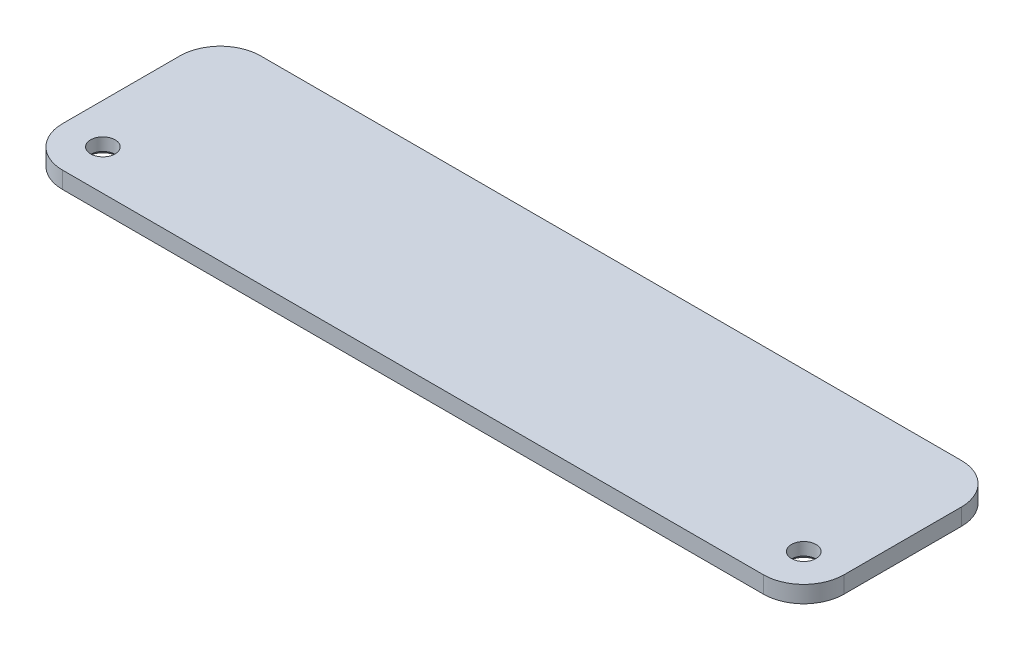
ISO-10303-21;
HEADER;
FILE_DESCRIPTION(('STEP AP214'),'2;1');
FILE_NAME('part.step','',(''),(''),'','','');
FILE_SCHEMA(('AUTOMOTIVE_DESIGN { 1 0 10303 214 1 1 1 1 }'));
ENDSEC;
DATA;
#1=APPLICATION_CONTEXT('core data for automotive mechanical design processes');
#2=APPLICATION_PROTOCOL_DEFINITION('international standard','automotive_design',2000,#1);
#3=PRODUCT_CONTEXT('',#1,'mechanical');
#4=PRODUCT('Part','Part','',(#3));
#5=PRODUCT_RELATED_PRODUCT_CATEGORY('part','',(#4));
#6=PRODUCT_DEFINITION_FORMATION('','',#4);
#7=PRODUCT_DEFINITION_CONTEXT('part definition',#1,'design');
#8=PRODUCT_DEFINITION('design','',#6,#7);
#9=PRODUCT_DEFINITION_SHAPE('','',#8);
#10=(LENGTH_UNIT() NAMED_UNIT(*) SI_UNIT(.MILLI.,.METRE.));
#11=(NAMED_UNIT(*) PLANE_ANGLE_UNIT() SI_UNIT($,.RADIAN.));
#12=(NAMED_UNIT(*) SI_UNIT($,.STERADIAN.) SOLID_ANGLE_UNIT());
#13=UNCERTAINTY_MEASURE_WITH_UNIT(LENGTH_MEASURE(1.E-05),#10,'distance_accuracy_value','');
#14=(GEOMETRIC_REPRESENTATION_CONTEXT(3) GLOBAL_UNCERTAINTY_ASSIGNED_CONTEXT((#13)) GLOBAL_UNIT_ASSIGNED_CONTEXT((#10,
#11,#12)) REPRESENTATION_CONTEXT('',''));
#15=CARTESIAN_POINT('',(0.,0.,0.));
#16=DIRECTION('',(0.,0.,1.));
#17=DIRECTION('',(1.,0.,0.));
#18=AXIS2_PLACEMENT_3D('',#15,#16,#17);
#19=CARTESIAN_POINT('',(50.,2.4,-22.5));
#20=DIRECTION('',(0.,-1.,0.));
#21=DIRECTION('',(0.,0.,-1.));
#22=AXIS2_PLACEMENT_3D('',#19,#20,#21);
#23=PLANE('',#22);
#24=CARTESIAN_POINT('',(50.,2.4,-22.5));
#25=DIRECTION('',(0.,1.,0.));
#26=DIRECTION('',(0.,0.,-1.));
#27=AXIS2_PLACEMENT_3D('',#24,#25,#26);
#28=CIRCLE('',#27,5.75);
#29=CARTESIAN_POINT('',(55.75,2.4,-22.5));
#30=VERTEX_POINT('',#29);
#31=CARTESIAN_POINT('',(50.,2.4,-28.25));
#32=VERTEX_POINT('',#31);
#33=EDGE_CURVE('E174',#30,#32,#28,.T.);
#34=ORIENTED_EDGE('',*,*,#33,.T.);
#35=DIRECTION('',(-1.,0.,0.));
#36=VECTOR('',#35,1.);
#37=CARTESIAN_POINT('',(-50.,2.4,-28.25));
#38=LINE('',#37,#36);
#39=CARTESIAN_POINT('',(-50.,2.4,-28.25));
#40=VERTEX_POINT('',#39);
#41=EDGE_CURVE('E110',#32,#40,#38,.T.);
#42=ORIENTED_EDGE('',*,*,#41,.T.);
#43=CARTESIAN_POINT('',(-50.,2.4,-22.5));
#44=DIRECTION('',(0.,1.,0.));
#45=DIRECTION('',(0.,0.,1.));
#46=AXIS2_PLACEMENT_3D('',#43,#44,#45);
#47=CIRCLE('',#46,5.75);
#48=CARTESIAN_POINT('',(-55.75,2.4,-22.5));
#49=VERTEX_POINT('',#48);
#50=EDGE_CURVE('E263',#40,#49,#47,.T.);
#51=ORIENTED_EDGE('',*,*,#50,.T.);
#52=DIRECTION('',(0.,0.,1.));
#53=VECTOR('',#52,1.);
#54=CARTESIAN_POINT('',(-55.75,2.4,-22.5));
#55=LINE('',#54,#53);
#56=CARTESIAN_POINT('',(-55.75,2.4,-5.75000000000001));
#57=VERTEX_POINT('',#56);
#58=EDGE_CURVE('E266',#49,#57,#55,.T.);
#59=ORIENTED_EDGE('',*,*,#58,.T.);
#60=CARTESIAN_POINT('',(-50.,2.4,-5.75000000000001));
#61=DIRECTION('',(0.,1.,0.));
#62=DIRECTION('',(0.,0.,1.));
#63=AXIS2_PLACEMENT_3D('',#60,#61,#62);
#64=CIRCLE('',#63,5.75);
#65=CARTESIAN_POINT('',(-50.,2.4,0.));
#66=VERTEX_POINT('',#65);
#67=EDGE_CURVE('E129',#57,#66,#64,.T.);
#68=ORIENTED_EDGE('',*,*,#67,.T.);
#69=DIRECTION('',(1.,0.,0.));
#70=VECTOR('',#69,1.);
#71=CARTESIAN_POINT('',(-50.,2.4,0.));
#72=LINE('',#71,#70);
#73=CARTESIAN_POINT('',(50.,2.4,0.));
#74=VERTEX_POINT('',#73);
#75=EDGE_CURVE('E123',#66,#74,#72,.T.);
#76=ORIENTED_EDGE('',*,*,#75,.T.);
#77=CARTESIAN_POINT('',(50.,2.4,-5.74999999999999));
#78=DIRECTION('',(0.,1.,0.));
#79=DIRECTION('',(0.,0.,1.));
#80=AXIS2_PLACEMENT_3D('',#77,#78,#79);
#81=CIRCLE('',#80,5.74999999999999);
#82=CARTESIAN_POINT('',(55.75,2.4,-5.74999999999999));
#83=VERTEX_POINT('',#82);
#84=EDGE_CURVE('E127',#74,#83,#81,.T.);
#85=ORIENTED_EDGE('',*,*,#84,.T.);
#86=DIRECTION('',(0.,0.,-1.));
#87=VECTOR('',#86,1.);
#88=CARTESIAN_POINT('',(55.75,2.4,-22.5));
#89=LINE('',#88,#87);
#90=EDGE_CURVE('E66',#83,#30,#89,.T.);
#91=ORIENTED_EDGE('',*,*,#90,.T.);
#92=EDGE_LOOP('',(#34,#42,#51,#59,#68,#76,#85,#91));
#93=FACE_BOUND('',#92,.T.);
#94=CARTESIAN_POINT('',(50.,2.4,-5.74999999999999));
#95=DIRECTION('',(0.,1.,0.));
#96=DIRECTION('',(0.,0.,1.));
#97=AXIS2_PLACEMENT_3D('',#94,#95,#96);
#98=CIRCLE('',#97,1.75);
#99=CARTESIAN_POINT('',(50.,2.4,-3.99999999999999));
#100=VERTEX_POINT('',#99);
#101=EDGE_CURVE('E156',#100,#100,#98,.T.);
#102=ORIENTED_EDGE('',*,*,#101,.F.);
#103=EDGE_LOOP('',(#102));
#104=FACE_BOUND('',#103,.T.);
#105=CARTESIAN_POINT('',(-50.,2.4,-5.75000000000001));
#106=DIRECTION('',(0.,1.,0.));
#107=DIRECTION('',(0.,0.,1.));
#108=AXIS2_PLACEMENT_3D('',#105,#106,#107);
#109=CIRCLE('',#108,1.75);
#110=CARTESIAN_POINT('',(-50.,2.4,-4.00000000000001));
#111=VERTEX_POINT('',#110);
#112=EDGE_CURVE('E251',#111,#111,#109,.T.);
#113=ORIENTED_EDGE('',*,*,#112,.F.);
#114=EDGE_LOOP('',(#113));
#115=FACE_BOUND('',#114,.T.);
#116=ADVANCED_FACE('F47',(#93,#104,#115),#23,.F.);
#117=CARTESIAN_POINT('',(50.,0.,-22.5));
#118=DIRECTION('',(0.,-1.,0.));
#119=DIRECTION('',(0.,0.,-1.));
#120=AXIS2_PLACEMENT_3D('',#117,#118,#119);
#121=PLANE('',#120);
#122=CARTESIAN_POINT('',(50.,0.,-5.74999999999999));
#123=DIRECTION('',(0.,-1.,0.));
#124=DIRECTION('',(0.,0.,-1.));
#125=AXIS2_PLACEMENT_3D('',#122,#123,#124);
#126=CIRCLE('',#125,2.35000000000001);
#127=CARTESIAN_POINT('',(50.,0.,-8.1));
#128=VERTEX_POINT('',#127);
#129=EDGE_CURVE('E200',#128,#128,#126,.F.);
#130=ORIENTED_EDGE('',*,*,#129,.T.);
#131=EDGE_LOOP('',(#130));
#132=FACE_BOUND('',#131,.T.);
#133=CARTESIAN_POINT('',(-50.,0.,-5.75000000000001));
#134=DIRECTION('',(0.,-1.,0.));
#135=DIRECTION('',(0.,0.,-1.));
#136=AXIS2_PLACEMENT_3D('',#133,#134,#135);
#137=CIRCLE('',#136,2.35000000000002);
#138=CARTESIAN_POINT('',(-50.,0.,-8.10000000000003));
#139=VERTEX_POINT('',#138);
#140=EDGE_CURVE('E196',#139,#139,#137,.F.);
#141=ORIENTED_EDGE('',*,*,#140,.T.);
#142=EDGE_LOOP('',(#141));
#143=FACE_BOUND('',#142,.T.);
#144=CARTESIAN_POINT('',(50.,0.,-22.5));
#145=DIRECTION('',(0.,1.,0.));
#146=DIRECTION('',(0.,0.,-1.));
#147=AXIS2_PLACEMENT_3D('',#144,#145,#146);
#148=CIRCLE('',#147,5.75);
#149=CARTESIAN_POINT('',(55.75,0.,-22.5));
#150=VERTEX_POINT('',#149);
#151=CARTESIAN_POINT('',(50.,0.,-28.25));
#152=VERTEX_POINT('',#151);
#153=EDGE_CURVE('E151',#150,#152,#148,.T.);
#154=ORIENTED_EDGE('',*,*,#153,.F.);
#155=DIRECTION('',(0.,0.,-1.));
#156=VECTOR('',#155,1.);
#157=CARTESIAN_POINT('',(55.75,0.,-22.5));
#158=LINE('',#157,#156);
#159=CARTESIAN_POINT('',(55.75,0.,-5.74999999999999));
#160=VERTEX_POINT('',#159);
#161=EDGE_CURVE('E101',#160,#150,#158,.T.);
#162=ORIENTED_EDGE('',*,*,#161,.F.);
#163=CARTESIAN_POINT('',(50.,0.,-5.74999999999999));
#164=DIRECTION('',(0.,1.,0.));
#165=DIRECTION('',(0.,0.,1.));
#166=AXIS2_PLACEMENT_3D('',#163,#164,#165);
#167=CIRCLE('',#166,5.74999999999999);
#168=CARTESIAN_POINT('',(50.,0.,0.));
#169=VERTEX_POINT('',#168);
#170=EDGE_CURVE('E95',#169,#160,#167,.T.);
#171=ORIENTED_EDGE('',*,*,#170,.F.);
#172=DIRECTION('',(1.,0.,0.));
#173=VECTOR('',#172,1.);
#174=CARTESIAN_POINT('',(-50.,0.,0.));
#175=LINE('',#174,#173);
#176=CARTESIAN_POINT('',(-50.,0.,0.));
#177=VERTEX_POINT('',#176);
#178=EDGE_CURVE('E138',#177,#169,#175,.T.);
#179=ORIENTED_EDGE('',*,*,#178,.F.);
#180=CARTESIAN_POINT('',(-50.,0.,-5.75000000000001));
#181=DIRECTION('',(0.,1.,0.));
#182=DIRECTION('',(0.,0.,1.));
#183=AXIS2_PLACEMENT_3D('',#180,#181,#182);
#184=CIRCLE('',#183,5.75);
#185=CARTESIAN_POINT('',(-55.75,0.,-5.75000000000001));
#186=VERTEX_POINT('',#185);
#187=EDGE_CURVE('E165',#186,#177,#184,.T.);
#188=ORIENTED_EDGE('',*,*,#187,.F.);
#189=DIRECTION('',(0.,0.,1.));
#190=VECTOR('',#189,1.);
#191=CARTESIAN_POINT('',(-55.75,0.,-22.5));
#192=LINE('',#191,#190);
#193=CARTESIAN_POINT('',(-55.75,0.,-22.5));
#194=VERTEX_POINT('',#193);
#195=EDGE_CURVE('E162',#194,#186,#192,.T.);
#196=ORIENTED_EDGE('',*,*,#195,.F.);
#197=CARTESIAN_POINT('',(-50.,0.,-22.5));
#198=DIRECTION('',(0.,1.,0.));
#199=DIRECTION('',(0.,0.,1.));
#200=AXIS2_PLACEMENT_3D('',#197,#198,#199);
#201=CIRCLE('',#200,5.75);
#202=CARTESIAN_POINT('',(-50.,0.,-28.25));
#203=VERTEX_POINT('',#202);
#204=EDGE_CURVE('E159',#203,#194,#201,.T.);
#205=ORIENTED_EDGE('',*,*,#204,.F.);
#206=DIRECTION('',(-1.,0.,0.));
#207=VECTOR('',#206,1.);
#208=CARTESIAN_POINT('',(-50.,0.,-28.25));
#209=LINE('',#208,#207);
#210=EDGE_CURVE('E155',#152,#203,#209,.T.);
#211=ORIENTED_EDGE('',*,*,#210,.F.);
#212=EDGE_LOOP('',(#154,#162,#171,#179,#188,#196,#205,#211));
#213=FACE_BOUND('',#212,.T.);
#214=ADVANCED_FACE('F216',(#132,#143,#213),#121,.T.);
#215=CARTESIAN_POINT('',(50.,2.4,-22.5));
#216=DIRECTION('',(0.,-1.,0.));
#217=DIRECTION('',(0.,0.,-1.));
#218=AXIS2_PLACEMENT_3D('',#215,#216,#217);
#219=CYLINDRICAL_SURFACE('',#218,5.75);
#220=ORIENTED_EDGE('',*,*,#153,.T.);
#221=DIRECTION('',(0.,-1.,0.));
#222=VECTOR('',#221,1.);
#223=CARTESIAN_POINT('',(50.,2.4,-28.25));
#224=LINE('',#223,#222);
#225=EDGE_CURVE('E193',#32,#152,#224,.T.);
#226=ORIENTED_EDGE('',*,*,#225,.F.);
#227=ORIENTED_EDGE('',*,*,#33,.F.);
#228=DIRECTION('',(0.,-1.,0.));
#229=VECTOR('',#228,1.);
#230=CARTESIAN_POINT('',(55.75,2.4,-22.5));
#231=LINE('',#230,#229);
#232=EDGE_CURVE('E147',#30,#150,#231,.T.);
#233=ORIENTED_EDGE('',*,*,#232,.T.);
#234=EDGE_LOOP('',(#220,#226,#227,#233));
#235=FACE_BOUND('',#234,.T.);
#236=ADVANCED_FACE('F219',(#235),#219,.T.);
#237=CARTESIAN_POINT('',(-50.,2.4,-28.25));
#238=DIRECTION('',(0.,0.,1.));
#239=DIRECTION('',(1.,0.,0.));
#240=AXIS2_PLACEMENT_3D('',#237,#238,#239);
#241=PLANE('',#240);
#242=ORIENTED_EDGE('',*,*,#210,.T.);
#243=DIRECTION('',(0.,-1.,0.));
#244=VECTOR('',#243,1.);
#245=CARTESIAN_POINT('',(-50.,2.4,-28.25));
#246=LINE('',#245,#244);
#247=EDGE_CURVE('E189',#40,#203,#246,.T.);
#248=ORIENTED_EDGE('',*,*,#247,.F.);
#249=ORIENTED_EDGE('',*,*,#41,.F.);
#250=ORIENTED_EDGE('',*,*,#225,.T.);
#251=EDGE_LOOP('',(#242,#248,#249,#250));
#252=FACE_BOUND('',#251,.T.);
#253=ADVANCED_FACE('F281',(#252),#241,.F.);
#254=CARTESIAN_POINT('',(-50.,2.4,-22.5));
#255=DIRECTION('',(0.,-1.,0.));
#256=DIRECTION('',(0.,0.,-1.));
#257=AXIS2_PLACEMENT_3D('',#254,#255,#256);
#258=CYLINDRICAL_SURFACE('',#257,5.75);
#259=ORIENTED_EDGE('',*,*,#204,.T.);
#260=DIRECTION('',(0.,-1.,0.));
#261=VECTOR('',#260,1.);
#262=CARTESIAN_POINT('',(-55.75,2.4,-22.5));
#263=LINE('',#262,#261);
#264=EDGE_CURVE('E185',#49,#194,#263,.T.);
#265=ORIENTED_EDGE('',*,*,#264,.F.);
#266=ORIENTED_EDGE('',*,*,#50,.F.);
#267=ORIENTED_EDGE('',*,*,#247,.T.);
#268=EDGE_LOOP('',(#259,#265,#266,#267));
#269=FACE_BOUND('',#268,.T.);
#270=ADVANCED_FACE('F280',(#269),#258,.T.);
#271=CARTESIAN_POINT('',(-55.75,2.4,-22.5));
#272=DIRECTION('',(1.,0.,0.));
#273=DIRECTION('',(0.,0.,-1.));
#274=AXIS2_PLACEMENT_3D('',#271,#272,#273);
#275=PLANE('',#274);
#276=ORIENTED_EDGE('',*,*,#195,.T.);
#277=DIRECTION('',(0.,-1.,0.));
#278=VECTOR('',#277,1.);
#279=CARTESIAN_POINT('',(-55.75,2.4,-5.75000000000001));
#280=LINE('',#279,#278);
#281=EDGE_CURVE('E181',#57,#186,#280,.T.);
#282=ORIENTED_EDGE('',*,*,#281,.F.);
#283=ORIENTED_EDGE('',*,*,#58,.F.);
#284=ORIENTED_EDGE('',*,*,#264,.T.);
#285=EDGE_LOOP('',(#276,#282,#283,#284));
#286=FACE_BOUND('',#285,.T.);
#287=ADVANCED_FACE('F274',(#286),#275,.F.);
#288=CARTESIAN_POINT('',(-50.,2.4,-5.75000000000001));
#289=DIRECTION('',(0.,-1.,0.));
#290=DIRECTION('',(0.,0.,-1.));
#291=AXIS2_PLACEMENT_3D('',#288,#289,#290);
#292=CYLINDRICAL_SURFACE('',#291,5.75);
#293=ORIENTED_EDGE('',*,*,#187,.T.);
#294=DIRECTION('',(0.,-1.,0.));
#295=VECTOR('',#294,1.);
#296=CARTESIAN_POINT('',(-50.,2.4,0.));
#297=LINE('',#296,#295);
#298=EDGE_CURVE('E140',#66,#177,#297,.T.);
#299=ORIENTED_EDGE('',*,*,#298,.F.);
#300=ORIENTED_EDGE('',*,*,#67,.F.);
#301=ORIENTED_EDGE('',*,*,#281,.T.);
#302=EDGE_LOOP('',(#293,#299,#300,#301));
#303=FACE_BOUND('',#302,.T.);
#304=ADVANCED_FACE('F278',(#303),#292,.T.);
#305=CARTESIAN_POINT('',(-50.,2.4,0.));
#306=DIRECTION('',(0.,0.,-1.));
#307=DIRECTION('',(-1.,0.,0.));
#308=AXIS2_PLACEMENT_3D('',#305,#306,#307);
#309=PLANE('',#308);
#310=ORIENTED_EDGE('',*,*,#178,.T.);
#311=DIRECTION('',(0.,-1.,0.));
#312=VECTOR('',#311,1.);
#313=CARTESIAN_POINT('',(50.,2.4,0.));
#314=LINE('',#313,#312);
#315=EDGE_CURVE('E135',#74,#169,#314,.T.);
#316=ORIENTED_EDGE('',*,*,#315,.F.);
#317=ORIENTED_EDGE('',*,*,#75,.F.);
#318=ORIENTED_EDGE('',*,*,#298,.T.);
#319=EDGE_LOOP('',(#310,#316,#317,#318));
#320=FACE_BOUND('',#319,.T.);
#321=ADVANCED_FACE('F136',(#320),#309,.F.);
#322=CARTESIAN_POINT('',(50.,2.4,-5.74999999999999));
#323=DIRECTION('',(0.,-1.,0.));
#324=DIRECTION('',(0.,0.,-1.));
#325=AXIS2_PLACEMENT_3D('',#322,#323,#324);
#326=CYLINDRICAL_SURFACE('',#325,5.74999999999999);
#327=ORIENTED_EDGE('',*,*,#170,.T.);
#328=DIRECTION('',(0.,-1.,0.));
#329=VECTOR('',#328,1.);
#330=CARTESIAN_POINT('',(55.75,2.4,-5.74999999999999));
#331=LINE('',#330,#329);
#332=EDGE_CURVE('E141',#83,#160,#331,.T.);
#333=ORIENTED_EDGE('',*,*,#332,.F.);
#334=ORIENTED_EDGE('',*,*,#84,.F.);
#335=ORIENTED_EDGE('',*,*,#315,.T.);
#336=EDGE_LOOP('',(#327,#333,#334,#335));
#337=FACE_BOUND('',#336,.T.);
#338=ADVANCED_FACE('F143',(#337),#326,.T.);
#339=CARTESIAN_POINT('',(55.75,2.4,-22.5));
#340=DIRECTION('',(-1.,0.,0.));
#341=DIRECTION('',(0.,0.,1.));
#342=AXIS2_PLACEMENT_3D('',#339,#340,#341);
#343=PLANE('',#342);
#344=ORIENTED_EDGE('',*,*,#161,.T.);
#345=ORIENTED_EDGE('',*,*,#232,.F.);
#346=ORIENTED_EDGE('',*,*,#90,.F.);
#347=ORIENTED_EDGE('',*,*,#332,.T.);
#348=EDGE_LOOP('',(#344,#345,#346,#347));
#349=FACE_BOUND('',#348,.T.);
#350=ADVANCED_FACE('F228',(#349),#343,.F.);
#351=CARTESIAN_POINT('',(50.,2.4,-5.74999999999999));
#352=DIRECTION('',(0.,-1.,0.));
#353=DIRECTION('',(0.,0.,-1.));
#354=AXIS2_PLACEMENT_3D('',#351,#352,#353);
#355=CYLINDRICAL_SURFACE('',#354,1.75);
#356=CARTESIAN_POINT('',(50.,0.599999999999998,-5.74999999999999));
#357=DIRECTION('',(0.,-1.,0.));
#358=DIRECTION('',(0.,0.,-1.));
#359=AXIS2_PLACEMENT_3D('',#356,#357,#358);
#360=CIRCLE('',#359,1.75);
#361=CARTESIAN_POINT('',(50.,0.599999999999998,-7.49999999999999));
#362=VERTEX_POINT('',#361);
#363=EDGE_CURVE('E58',#362,#362,#360,.T.);
#364=ORIENTED_EDGE('',*,*,#363,.T.);
#365=EDGE_LOOP('',(#364));
#366=FACE_BOUND('',#365,.T.);
#367=ORIENTED_EDGE('',*,*,#101,.T.);
#368=EDGE_LOOP('',(#367));
#369=FACE_BOUND('',#368,.T.);
#370=ADVANCED_FACE('F207',(#366,#369),#355,.F.);
#371=CARTESIAN_POINT('',(-50.,2.4,-5.75000000000001));
#372=DIRECTION('',(0.,-1.,0.));
#373=DIRECTION('',(0.,0.,-1.));
#374=AXIS2_PLACEMENT_3D('',#371,#372,#373);
#375=CYLINDRICAL_SURFACE('',#374,1.75);
#376=CARTESIAN_POINT('',(-50.,0.600000000000019,-5.75000000000001));
#377=DIRECTION('',(0.,-1.,0.));
#378=DIRECTION('',(0.,0.,-1.));
#379=AXIS2_PLACEMENT_3D('',#376,#377,#378);
#380=CIRCLE('',#379,1.75);
#381=CARTESIAN_POINT('',(-50.,0.600000000000019,-7.50000000000001));
#382=VERTEX_POINT('',#381);
#383=EDGE_CURVE('E11',#382,#382,#380,.T.);
#384=ORIENTED_EDGE('',*,*,#383,.T.);
#385=EDGE_LOOP('',(#384));
#386=FACE_BOUND('',#385,.T.);
#387=ORIENTED_EDGE('',*,*,#112,.T.);
#388=EDGE_LOOP('',(#387));
#389=FACE_BOUND('',#388,.T.);
#390=ADVANCED_FACE('F213',(#386,#389),#375,.F.);
#391=CARTESIAN_POINT('',(50.,0.,-5.74999999999999));
#392=DIRECTION('',(0.,-1.,0.));
#393=DIRECTION('',(0.,0.,-1.));
#394=AXIS2_PLACEMENT_3D('',#391,#392,#393);
#395=CONICAL_SURFACE('',#394,2.35000000000001,0.785398163397452);
#396=ORIENTED_EDGE('',*,*,#363,.F.);
#397=EDGE_LOOP('',(#396));
#398=FACE_BOUND('',#397,.T.);
#399=ORIENTED_EDGE('',*,*,#129,.F.);
#400=EDGE_LOOP('',(#399));
#401=FACE_BOUND('',#400,.T.);
#402=ADVANCED_FACE('F210',(#398,#401),#395,.F.);
#403=CARTESIAN_POINT('',(-50.,0.,-5.75000000000001));
#404=DIRECTION('',(0.,-1.,0.));
#405=DIRECTION('',(0.,0.,-1.));
#406=AXIS2_PLACEMENT_3D('',#403,#404,#405);
#407=CONICAL_SURFACE('',#406,2.35000000000002,0.785398163397452);
#408=CARTESIAN_POINT('',(-50.,0.600000000000019,-7.50000000000001));
#409=CARTESIAN_POINT('',(-50.,0.593750000000018,-7.50625));
#410=CARTESIAN_POINT('',(-50.,0.587500000000018,-7.5125));
#411=CARTESIAN_POINT('',(-50.,0.575000000000018,-7.525));
#412=CARTESIAN_POINT('',(-50.,0.568750000000018,-7.53125000000001));
#413=CARTESIAN_POINT('',(-50.,0.556250000000017,-7.54375000000001));
#414=CARTESIAN_POINT('',(-50.,0.550000000000017,-7.55000000000001));
#415=CARTESIAN_POINT('',(-50.,0.537500000000017,-7.56250000000001));
#416=CARTESIAN_POINT('',(-50.,0.531250000000016,-7.56875000000001));
#417=CARTESIAN_POINT('',(-50.,0.518750000000016,-7.58125000000001));
#418=CARTESIAN_POINT('',(-50.,0.512500000000016,-7.58750000000001));
#419=CARTESIAN_POINT('',(-50.,0.500000000000016,-7.60000000000001));
#420=CARTESIAN_POINT('',(-50.,0.493750000000015,-7.60625000000001));
#421=CARTESIAN_POINT('',(-50.,0.481250000000015,-7.61875000000001));
#422=CARTESIAN_POINT('',(-50.,0.475000000000015,-7.62500000000001));
#423=CARTESIAN_POINT('',(-50.,0.462500000000014,-7.63750000000001));
#424=CARTESIAN_POINT('',(-50.,0.456250000000014,-7.64375000000001));
#425=CARTESIAN_POINT('',(-50.,0.443750000000014,-7.65625000000001));
#426=CARTESIAN_POINT('',(-50.,0.437500000000013,-7.66250000000001));
#427=CARTESIAN_POINT('',(-50.,0.425000000000013,-7.67500000000001));
#428=CARTESIAN_POINT('',(-50.,0.418750000000013,-7.68125000000001));
#429=CARTESIAN_POINT('',(-50.,0.406250000000013,-7.69375000000001));
#430=CARTESIAN_POINT('',(-50.,0.400000000000012,-7.70000000000001));
#431=CARTESIAN_POINT('',(-50.,0.387500000000012,-7.71250000000001));
#432=CARTESIAN_POINT('',(-50.,0.381250000000012,-7.71875000000001));
#433=CARTESIAN_POINT('',(-50.,0.368750000000011,-7.73125000000001));
#434=CARTESIAN_POINT('',(-50.,0.362500000000011,-7.73750000000001));
#435=CARTESIAN_POINT('',(-50.,0.350000000000011,-7.75000000000001));
#436=CARTESIAN_POINT('',(-50.,0.343750000000011,-7.75625000000001));
#437=CARTESIAN_POINT('',(-50.,0.33125000000001,-7.76875000000001));
#438=CARTESIAN_POINT('',(-50.,0.32500000000001,-7.77500000000002));
#439=CARTESIAN_POINT('',(-50.,0.31250000000001,-7.78750000000002));
#440=CARTESIAN_POINT('',(-50.,0.30625000000001,-7.79375000000002));
#441=CARTESIAN_POINT('',(-50.,0.293750000000009,-7.80625000000002));
#442=CARTESIAN_POINT('',(-50.,0.287500000000009,-7.81250000000002));
#443=CARTESIAN_POINT('',(-50.,0.275000000000008,-7.82500000000002));
#444=CARTESIAN_POINT('',(-50.,0.268750000000009,-7.83125000000002));
#445=CARTESIAN_POINT('',(-50.,0.256250000000008,-7.84375000000002));
#446=CARTESIAN_POINT('',(-50.,0.250000000000008,-7.85000000000002));
#447=CARTESIAN_POINT('',(-50.,0.237500000000007,-7.86250000000002));
#448=CARTESIAN_POINT('',(-50.,0.231250000000007,-7.86875000000002));
#449=CARTESIAN_POINT('',(-50.,0.218750000000007,-7.88125000000002));
#450=CARTESIAN_POINT('',(-50.,0.212500000000007,-7.88750000000002));
#451=CARTESIAN_POINT('',(-50.,0.200000000000006,-7.90000000000002));
#452=CARTESIAN_POINT('',(-50.,0.193750000000006,-7.90625000000002));
#453=CARTESIAN_POINT('',(-50.,0.181250000000006,-7.91875000000002));
#454=CARTESIAN_POINT('',(-50.,0.175000000000006,-7.92500000000002));
#455=CARTESIAN_POINT('',(-50.,0.162500000000005,-7.93750000000002));
#456=CARTESIAN_POINT('',(-50.,0.156250000000005,-7.94375000000002));
#457=CARTESIAN_POINT('',(-50.,0.143750000000004,-7.95625000000002));
#458=CARTESIAN_POINT('',(-50.,0.137500000000004,-7.96250000000002));
#459=CARTESIAN_POINT('',(-50.,0.125000000000004,-7.97500000000002));
#460=CARTESIAN_POINT('',(-50.,0.118750000000004,-7.98125000000002));
#461=CARTESIAN_POINT('',(-50.,0.106250000000003,-7.99375000000002));
#462=CARTESIAN_POINT('',(-50.,0.100000000000003,-8.00000000000002));
#463=CARTESIAN_POINT('',(-50.,0.0875000000000028,-8.01250000000002));
#464=CARTESIAN_POINT('',(-50.,0.0812500000000028,-8.01875000000002));
#465=CARTESIAN_POINT('',(-50.,0.0687500000000022,-8.03125000000002));
#466=CARTESIAN_POINT('',(-50.,0.0625000000000018,-8.03750000000003));
#467=CARTESIAN_POINT('',(-50.,0.0500000000000014,-8.05000000000003));
#468=CARTESIAN_POINT('',(-50.,0.0437500000000015,-8.05625000000003));
#469=CARTESIAN_POINT('',(-50.,0.0312500000000012,-8.06875000000003));
#470=CARTESIAN_POINT('',(-50.,0.0250000000000008,-8.07500000000003));
#471=CARTESIAN_POINT('',(-50.,0.0125,-8.08750000000003));
#472=CARTESIAN_POINT('',(-50.,0.00624999999999967,-8.09375000000003));
#473=CARTESIAN_POINT('',(-50.,0.,-8.10000000000003));
#474=B_SPLINE_CURVE_WITH_KNOTS('',3,(#408,#409,#410,#411,#412,#413,#414,#415,#416,#417,#418,
#419,#420,#421,#422,#423,#424,#425,#426,#427,#428,#429,#430,#431,#432,#433,#434,#435,#436,#437,
#438,#439,#440,#441,#442,#443,#444,#445,#446,#447,#448,#449,#450,#451,#452,#453,#454,#455,#456,
#457,#458,#459,#460,#461,#462,#463,#464,#465,#466,#467,#468,#469,#470,#471,#472,#473),
.UNSPECIFIED.,.F.,.F.,(4,2,2,2,2,2,2,2,2,2,2,2,2,2,2,2,2,2,2,2,2,2,2,2,2,2,2,2,2,2,2,2,4),(0.,
0.0265165042944957,0.0530330085889927,0.079549512883489,0.106066017177985,0.132582521472482,
0.159099025766979,0.185615530061475,0.212132034355971,0.238648538650468,0.265165042944964,
0.291681547239461,0.318198051533957,0.344714555828453,0.37123106012295,0.397747564417447,
0.424264068711943,0.450780573006439,0.477297077300936,0.503813581595432,0.530330085889929,
0.556846590184425,0.583363094478922,0.609879598773419,0.636396103067914,0.662912607362411,
0.689429111656907,0.715945615951404,0.742462120245901,0.768978624540397,0.795495128834893,
0.822011633129389,0.848528137423886),.UNSPECIFIED.);
#475=EDGE_CURVE('BSEAM50',#382,#139,#474,.T.);
#476=ORIENTED_EDGE('',*,*,#383,.F.);
#477=ORIENTED_EDGE('',*,*,#140,.F.);
#478=ORIENTED_EDGE('',*,*,#475,.T.);
#479=ORIENTED_EDGE('',*,*,#475,.F.);
#480=EDGE_LOOP('',(#476,#478,#477,#479));
#481=FACE_BOUND('',#480,.T.);
#482=ADVANCED_FACE('F50',(#481),#407,.F.);
#483=CLOSED_SHELL('',(#116,#214,#236,#253,#270,#287,#304,#321,#338,#350,#370,#390,#402,#482));
#484=MANIFOLD_SOLID_BREP('B2',#483);
#485=ADVANCED_BREP_SHAPE_REPRESENTATION('',(#18,#484),#14);
#486=SHAPE_DEFINITION_REPRESENTATION(#9,#485);
ENDSEC;
END-ISO-10303-21;
